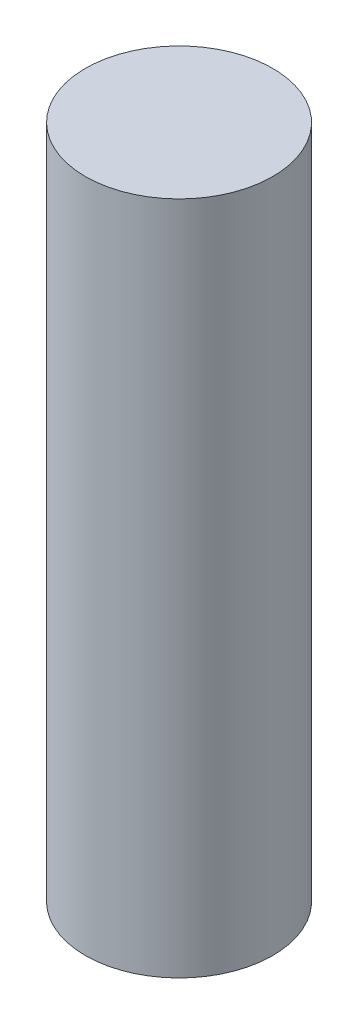
ISO-10303-21;
HEADER;
FILE_DESCRIPTION(('STEP AP214'),'2;1');
FILE_NAME('part.step','',(''),(''),'','','');
FILE_SCHEMA(('AUTOMOTIVE_DESIGN { 1 0 10303 214 1 1 1 1 }'));
ENDSEC;
DATA;
#1=APPLICATION_CONTEXT('core data for automotive mechanical design processes');
#2=APPLICATION_PROTOCOL_DEFINITION('international standard','automotive_design',2000,#1);
#3=PRODUCT_CONTEXT('',#1,'mechanical');
#4=PRODUCT('Part','Part','',(#3));
#5=PRODUCT_RELATED_PRODUCT_CATEGORY('part','',(#4));
#6=PRODUCT_DEFINITION_FORMATION('','',#4);
#7=PRODUCT_DEFINITION_CONTEXT('part definition',#1,'design');
#8=PRODUCT_DEFINITION('design','',#6,#7);
#9=PRODUCT_DEFINITION_SHAPE('','',#8);
#10=(LENGTH_UNIT() NAMED_UNIT(*) SI_UNIT(.MILLI.,.METRE.));
#11=(NAMED_UNIT(*) PLANE_ANGLE_UNIT() SI_UNIT($,.RADIAN.));
#12=(NAMED_UNIT(*) SI_UNIT($,.STERADIAN.) SOLID_ANGLE_UNIT());
#13=UNCERTAINTY_MEASURE_WITH_UNIT(LENGTH_MEASURE(1.E-05),#10,'distance_accuracy_value','');
#14=(GEOMETRIC_REPRESENTATION_CONTEXT(3) GLOBAL_UNCERTAINTY_ASSIGNED_CONTEXT((#13)) GLOBAL_UNIT_ASSIGNED_CONTEXT((#10,
#11,#12)) REPRESENTATION_CONTEXT('',''));
#15=CARTESIAN_POINT('',(0.,0.,0.));
#16=DIRECTION('',(0.,0.,1.));
#17=DIRECTION('',(1.,0.,0.));
#18=AXIS2_PLACEMENT_3D('',#15,#16,#17);
#19=CARTESIAN_POINT('',(0.,66.04,0.));
#20=DIRECTION('',(0.,-1.,0.));
#21=DIRECTION('',(0.,0.,-1.));
#22=AXIS2_PLACEMENT_3D('',#19,#20,#21);
#23=CYLINDRICAL_SURFACE('',#22,12.7);
#24=CARTESIAN_POINT('',(0.,0.,0.));
#25=DIRECTION('',(0.,1.,0.));
#26=DIRECTION('',(0.,0.,1.));
#27=AXIS2_PLACEMENT_3D('',#24,#25,#26);
#28=CIRCLE('',#27,12.7);
#29=CARTESIAN_POINT('',(0.,0.,12.7));
#30=VERTEX_POINT('',#29);
#31=EDGE_CURVE('E10',#30,#30,#28,.T.);
#32=ORIENTED_EDGE('',*,*,#31,.T.);
#33=EDGE_LOOP('',(#32));
#34=FACE_BOUND('',#33,.T.);
#35=CARTESIAN_POINT('',(0.,91.44,0.));
#36=DIRECTION('',(0.,1.,0.));
#37=DIRECTION('',(0.,0.,1.));
#38=AXIS2_PLACEMENT_3D('',#35,#36,#37);
#39=CIRCLE('',#38,12.7);
#40=CARTESIAN_POINT('',(0.,91.44,12.7));
#41=VERTEX_POINT('',#40);
#42=EDGE_CURVE('E37',#41,#41,#39,.T.);
#43=ORIENTED_EDGE('',*,*,#42,.F.);
#44=EDGE_LOOP('',(#43));
#45=FACE_BOUND('',#44,.T.);
#46=ADVANCED_FACE('F31',(#34,#45),#23,.T.);
#47=CARTESIAN_POINT('',(0.,0.,0.));
#48=DIRECTION('',(0.,1.,0.));
#49=DIRECTION('',(0.,0.,1.));
#50=AXIS2_PLACEMENT_3D('',#47,#48,#49);
#51=PLANE('',#50);
#52=ORIENTED_EDGE('',*,*,#31,.F.);
#53=EDGE_LOOP('',(#52));
#54=FACE_BOUND('',#53,.T.);
#55=ADVANCED_FACE('F46',(#54),#51,.F.);
#56=CARTESIAN_POINT('',(0.,91.44,0.));
#57=DIRECTION('',(0.,1.,0.));
#58=DIRECTION('',(0.,0.,1.));
#59=AXIS2_PLACEMENT_3D('',#56,#57,#58);
#60=PLANE('',#59);
#61=ORIENTED_EDGE('',*,*,#42,.T.);
#62=EDGE_LOOP('',(#61));
#63=FACE_BOUND('',#62,.T.);
#64=ADVANCED_FACE('F43',(#63),#60,.T.);
#65=CLOSED_SHELL('',(#46,#55,#64));
#66=MANIFOLD_SOLID_BREP('B2',#65);
#67=ADVANCED_BREP_SHAPE_REPRESENTATION('',(#18,#66),#14);
#68=SHAPE_DEFINITION_REPRESENTATION(#9,#67);
ENDSEC;
END-ISO-10303-21;
